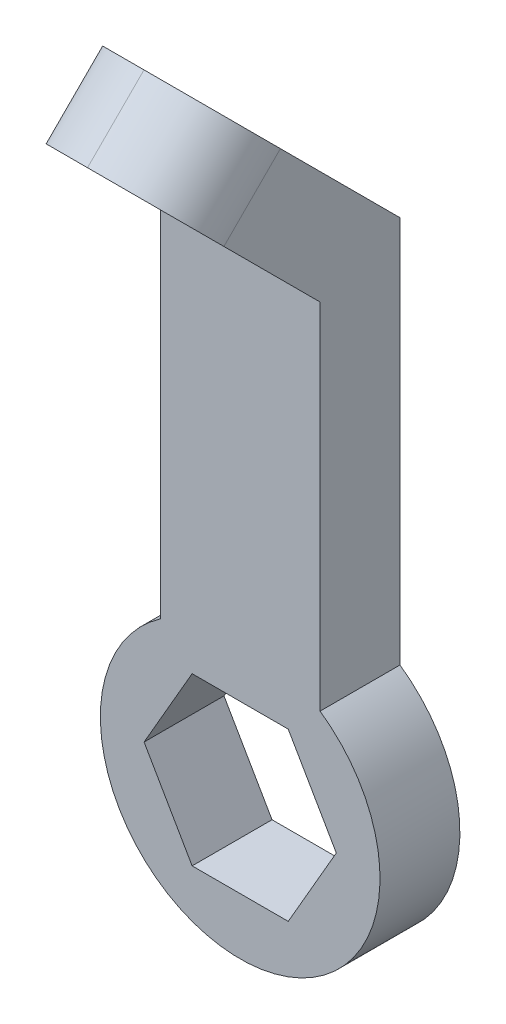
ISO-10303-21;
HEADER;
FILE_DESCRIPTION(('STEP AP214'),'2;1');
FILE_NAME('part.step','',(''),(''),'','','');
FILE_SCHEMA(('AUTOMOTIVE_DESIGN { 1 0 10303 214 1 1 1 1 }'));
ENDSEC;
DATA;
#1=APPLICATION_CONTEXT('core data for automotive mechanical design processes');
#2=APPLICATION_PROTOCOL_DEFINITION('international standard','automotive_design',2000,#1);
#3=PRODUCT_CONTEXT('',#1,'mechanical');
#4=PRODUCT('Part','Part','',(#3));
#5=PRODUCT_RELATED_PRODUCT_CATEGORY('part','',(#4));
#6=PRODUCT_DEFINITION_FORMATION('','',#4);
#7=PRODUCT_DEFINITION_CONTEXT('part definition',#1,'design');
#8=PRODUCT_DEFINITION('design','',#6,#7);
#9=PRODUCT_DEFINITION_SHAPE('','',#8);
#10=(LENGTH_UNIT() NAMED_UNIT(*) SI_UNIT(.MILLI.,.METRE.));
#11=(NAMED_UNIT(*) PLANE_ANGLE_UNIT() SI_UNIT($,.RADIAN.));
#12=(NAMED_UNIT(*) SI_UNIT($,.STERADIAN.) SOLID_ANGLE_UNIT());
#13=UNCERTAINTY_MEASURE_WITH_UNIT(LENGTH_MEASURE(1.E-05),#10,'distance_accuracy_value','');
#14=(GEOMETRIC_REPRESENTATION_CONTEXT(3) GLOBAL_UNCERTAINTY_ASSIGNED_CONTEXT((#13)) GLOBAL_UNIT_ASSIGNED_CONTEXT((#10,
#11,#12)) REPRESENTATION_CONTEXT('',''));
#15=CARTESIAN_POINT('',(0.,0.,0.));
#16=DIRECTION('',(0.,0.,1.));
#17=DIRECTION('',(1.,0.,0.));
#18=AXIS2_PLACEMENT_3D('',#15,#16,#17);
#19=CARTESIAN_POINT('',(0.,21497.4193257272,4507.64904237391));
#20=DIRECTION('',(0.,0.,-1.));
#21=DIRECTION('',(-1.,0.,0.));
#22=AXIS2_PLACEMENT_3D('',#19,#20,#21);
#23=PLANE('',#22);
#24=DIRECTION('',(-0.5,0.866025403784438,0.));
#25=VECTOR('',#24,1.);
#26=CARTESIAN_POINT('',(-10.8253175473055,21491.1693257272,4507.64904237391));
#27=LINE('',#26,#25);
#28=CARTESIAN_POINT('',(-7.21687836487034,21484.9193257272,4507.64904237391));
#29=VERTEX_POINT('',#28);
#30=CARTESIAN_POINT('',(-14.4337567297407,21497.4193257272,4507.64904237391));
#31=VERTEX_POINT('',#30);
#32=EDGE_CURVE('E260',#29,#31,#27,.T.);
#33=ORIENTED_EDGE('',*,*,#32,.T.);
#34=DIRECTION('',(0.5,0.866025403784439,0.));
#35=VECTOR('',#34,1.);
#36=CARTESIAN_POINT('',(-10.8253175473055,21503.6693257272,4507.64904237391));
#37=LINE('',#36,#35);
#38=CARTESIAN_POINT('',(-7.21687836487035,21509.9193257272,4507.64904237391));
#39=VERTEX_POINT('',#38);
#40=EDGE_CURVE('E263',#31,#39,#37,.T.);
#41=ORIENTED_EDGE('',*,*,#40,.T.);
#42=DIRECTION('',(1.,0.,0.));
#43=VECTOR('',#42,1.);
#44=CARTESIAN_POINT('',(0.,21509.9193257272,4507.64904237391));
#45=LINE('',#44,#43);
#46=CARTESIAN_POINT('',(7.21687836487029,21509.9193257272,4507.64904237391));
#47=VERTEX_POINT('',#46);
#48=EDGE_CURVE('E245',#39,#47,#45,.T.);
#49=ORIENTED_EDGE('',*,*,#48,.T.);
#50=DIRECTION('',(0.500000000000001,-0.866025403784438,0.));
#51=VECTOR('',#50,1.);
#52=CARTESIAN_POINT('',(10.8253175473055,21503.6693257272,4507.64904237391));
#53=LINE('',#52,#51);
#54=CARTESIAN_POINT('',(14.4337567297406,21497.4193257272,4507.64904237391));
#55=VERTEX_POINT('',#54);
#56=EDGE_CURVE('E218',#47,#55,#53,.T.);
#57=ORIENTED_EDGE('',*,*,#56,.T.);
#58=DIRECTION('',(-0.5,-0.866025403784439,0.));
#59=VECTOR('',#58,1.);
#60=CARTESIAN_POINT('',(10.8253175473055,21491.1693257272,4507.64904237391));
#61=LINE('',#60,#59);
#62=CARTESIAN_POINT('',(7.21687836487029,21484.9193257272,4507.64904237391));
#63=VERTEX_POINT('',#62);
#64=EDGE_CURVE('E254',#55,#63,#61,.T.);
#65=ORIENTED_EDGE('',*,*,#64,.T.);
#66=DIRECTION('',(-1.,0.,0.));
#67=VECTOR('',#66,1.);
#68=CARTESIAN_POINT('',(0.,21484.9193257272,4507.64904237391));
#69=LINE('',#68,#67);
#70=EDGE_CURVE('E257',#63,#29,#69,.T.);
#71=ORIENTED_EDGE('',*,*,#70,.T.);
#72=EDGE_LOOP('',(#33,#41,#49,#57,#65,#71));
#73=FACE_BOUND('',#72,.T.);
#74=DIRECTION('',(1.,0.,0.));
#75=VECTOR('',#74,1.);
#76=CARTESIAN_POINT('',(0.,21567.8673257556,4507.64904237391));
#77=LINE('',#76,#75);
#78=CARTESIAN_POINT('',(-12.,21567.8673257556,4507.64904237391));
#79=VERTEX_POINT('',#78);
#80=CARTESIAN_POINT('',(12.,21567.8673257556,4507.64904237391));
#81=VERTEX_POINT('',#80);
#82=EDGE_CURVE('E295',#79,#81,#77,.T.);
#83=ORIENTED_EDGE('',*,*,#82,.F.);
#84=DIRECTION('',(0.,1.,0.));
#85=VECTOR('',#84,1.);
#86=CARTESIAN_POINT('',(-12.,21497.4193257272,4507.64904237391));
#87=LINE('',#86,#85);
#88=CARTESIAN_POINT('',(-12.,21514.6530145218,4507.64904237391));
#89=VERTEX_POINT('',#88);
#90=EDGE_CURVE('E280',#89,#79,#87,.T.);
#91=ORIENTED_EDGE('',*,*,#90,.F.);
#92=CARTESIAN_POINT('',(0.,21497.4193257272,4507.64904237391));
#93=DIRECTION('',(0.,0.,-1.));
#94=DIRECTION('',(-1.,0.,0.));
#95=AXIS2_PLACEMENT_3D('',#92,#93,#94);
#96=CIRCLE('',#95,21.0000007016508);
#97=CARTESIAN_POINT('',(12.,21514.6530145218,4507.64904237391));
#98=VERTEX_POINT('',#97);
#99=EDGE_CURVE('E289',#98,#89,#96,.T.);
#100=ORIENTED_EDGE('',*,*,#99,.F.);
#101=DIRECTION('',(0.,1.,0.));
#102=VECTOR('',#101,1.);
#103=CARTESIAN_POINT('',(12.,21497.4193257272,4507.64904237391));
#104=LINE('',#103,#102);
#105=EDGE_CURVE('E277',#98,#81,#104,.T.);
#106=ORIENTED_EDGE('',*,*,#105,.T.);
#107=EDGE_LOOP('',(#83,#91,#100,#106));
#108=FACE_BOUND('',#107,.T.);
#109=ADVANCED_FACE('F117',(#73,#108),#23,.F.);
#110=CARTESIAN_POINT('',(0.,21497.4193257272,4495.64904237391));
#111=DIRECTION('',(0.,0.,-1.));
#112=DIRECTION('',(-1.,0.,0.));
#113=AXIS2_PLACEMENT_3D('',#110,#111,#112);
#114=PLANE('',#113);
#115=DIRECTION('',(0.5,0.866025403784439,0.));
#116=VECTOR('',#115,1.);
#117=CARTESIAN_POINT('',(-10.8253175473055,21503.6693257272,4495.64904237391));
#118=LINE('',#117,#116);
#119=CARTESIAN_POINT('',(-14.4337567297407,21497.4193257272,4495.64904237391));
#120=VERTEX_POINT('',#119);
#121=CARTESIAN_POINT('',(-7.21687836487035,21509.9193257272,4495.64904237391));
#122=VERTEX_POINT('',#121);
#123=EDGE_CURVE('E141',#120,#122,#118,.T.);
#124=ORIENTED_EDGE('',*,*,#123,.F.);
#125=DIRECTION('',(-0.5,0.866025403784438,0.));
#126=VECTOR('',#125,1.);
#127=CARTESIAN_POINT('',(-10.8253175473055,21491.1693257272,4495.64904237391));
#128=LINE('',#127,#126);
#129=CARTESIAN_POINT('',(-7.21687836487034,21484.9193257272,4495.64904237391));
#130=VERTEX_POINT('',#129);
#131=EDGE_CURVE('E240',#130,#120,#128,.T.);
#132=ORIENTED_EDGE('',*,*,#131,.F.);
#133=DIRECTION('',(-1.,0.,0.));
#134=VECTOR('',#133,1.);
#135=CARTESIAN_POINT('',(0.,21484.9193257272,4495.64904237391));
#136=LINE('',#135,#134);
#137=CARTESIAN_POINT('',(7.21687836487029,21484.9193257272,4495.64904237391));
#138=VERTEX_POINT('',#137);
#139=EDGE_CURVE('E234',#138,#130,#136,.T.);
#140=ORIENTED_EDGE('',*,*,#139,.F.);
#141=DIRECTION('',(-0.5,-0.866025403784439,0.));
#142=VECTOR('',#141,1.);
#143=CARTESIAN_POINT('',(10.8253175473055,21491.1693257272,4495.64904237391));
#144=LINE('',#143,#142);
#145=CARTESIAN_POINT('',(14.4337567297406,21497.4193257272,4495.64904237391));
#146=VERTEX_POINT('',#145);
#147=EDGE_CURVE('E232',#146,#138,#144,.T.);
#148=ORIENTED_EDGE('',*,*,#147,.F.);
#149=DIRECTION('',(0.5,-0.866025403784438,0.));
#150=VECTOR('',#149,1.);
#151=CARTESIAN_POINT('',(10.8253175473055,21503.6693257272,4495.64904237391));
#152=LINE('',#151,#150);
#153=CARTESIAN_POINT('',(7.21687836487029,21509.9193257272,4495.64904237391));
#154=VERTEX_POINT('',#153);
#155=EDGE_CURVE('E215',#154,#146,#152,.T.);
#156=ORIENTED_EDGE('',*,*,#155,.F.);
#157=DIRECTION('',(1.,0.,0.));
#158=VECTOR('',#157,1.);
#159=CARTESIAN_POINT('',(0.,21509.9193257272,4495.64904237391));
#160=LINE('',#159,#158);
#161=EDGE_CURVE('E224',#122,#154,#160,.T.);
#162=ORIENTED_EDGE('',*,*,#161,.F.);
#163=EDGE_LOOP('',(#124,#132,#140,#148,#156,#162));
#164=FACE_BOUND('',#163,.T.);
#165=DIRECTION('',(0.,1.,0.));
#166=VECTOR('',#165,1.);
#167=CARTESIAN_POINT('',(12.,21497.4193257272,4495.64904237391));
#168=LINE('',#167,#166);
#169=CARTESIAN_POINT('',(12.,21514.6530145218,4495.64904237391));
#170=VERTEX_POINT('',#169);
#171=CARTESIAN_POINT('',(12.,21572.83788957,4495.64904237391));
#172=VERTEX_POINT('',#171);
#173=EDGE_CURVE('E285',#170,#172,#168,.T.);
#174=ORIENTED_EDGE('',*,*,#173,.F.);
#175=CARTESIAN_POINT('',(0.,21497.4193257272,4495.64904237391));
#176=DIRECTION('',(0.,0.,-1.));
#177=DIRECTION('',(-1.,0.,0.));
#178=AXIS2_PLACEMENT_3D('',#175,#176,#177);
#179=CIRCLE('',#178,21.0000007016508);
#180=CARTESIAN_POINT('',(-12.,21514.6530145218,4495.64904237391));
#181=VERTEX_POINT('',#180);
#182=EDGE_CURVE('E272',#170,#181,#179,.T.);
#183=ORIENTED_EDGE('',*,*,#182,.T.);
#184=DIRECTION('',(0.,1.,0.));
#185=VECTOR('',#184,1.);
#186=CARTESIAN_POINT('',(-12.,21497.4193257272,4495.64904237391));
#187=LINE('',#186,#185);
#188=CARTESIAN_POINT('',(-12.,21572.83788957,4495.64904237391));
#189=VERTEX_POINT('',#188);
#190=EDGE_CURVE('E288',#181,#189,#187,.T.);
#191=ORIENTED_EDGE('',*,*,#190,.T.);
#192=DIRECTION('',(1.,0.,0.));
#193=VECTOR('',#192,1.);
#194=CARTESIAN_POINT('',(0.,21572.83788957,4495.64904237391));
#195=LINE('',#194,#193);
#196=EDGE_CURVE('E281',#189,#172,#195,.T.);
#197=ORIENTED_EDGE('',*,*,#196,.T.);
#198=EDGE_LOOP('',(#174,#183,#191,#197));
#199=FACE_BOUND('',#198,.T.);
#200=ADVANCED_FACE('F228',(#164,#199),#114,.T.);
#201=CARTESIAN_POINT('',(-12.,21497.4193257272,4507.64904237391));
#202=DIRECTION('',(-1.,0.,0.));
#203=DIRECTION('',(0.,0.,1.));
#204=AXIS2_PLACEMENT_3D('',#201,#202,#203);
#205=PLANE('',#204);
#206=DIRECTION('',(0.,0.707106673962432,0.707106888410646));
#207=VECTOR('',#206,1.);
#208=CARTESIAN_POINT('',(-12.,21564.3526069091,4504.13432246146));
#209=LINE('',#208,#207);
#210=CARTESIAN_POINT('',(-12.,21582.3131164277,4522.09483742709));
#211=VERTEX_POINT('',#210);
#212=EDGE_CURVE('E266',#79,#211,#209,.T.);
#213=ORIENTED_EDGE('',*,*,#212,.T.);
#214=DIRECTION('',(0.,0.707106888410647,-0.707106673962432));
#215=VECTOR('',#214,1.);
#216=CARTESIAN_POINT('',(-12.,21547.089105731,4557.31883744128));
#217=LINE('',#216,#215);
#218=CARTESIAN_POINT('',(-12.,21590.7983990886,4513.60955733954));
#219=VERTEX_POINT('',#218);
#220=EDGE_CURVE('E12',#211,#219,#217,.T.);
#221=ORIENTED_EDGE('',*,*,#220,.T.);
#222=DIRECTION('',(0.,0.707106673962432,0.707106888410646));
#223=VECTOR('',#222,1.);
#224=CARTESIAN_POINT('',(-12.,21572.83788957,4495.64904237391));
#225=LINE('',#224,#223);
#226=EDGE_CURVE('E273',#189,#219,#225,.T.);
#227=ORIENTED_EDGE('',*,*,#226,.F.);
#228=ORIENTED_EDGE('',*,*,#190,.F.);
#229=DIRECTION('',(0.,0.,-1.));
#230=VECTOR('',#229,1.);
#231=CARTESIAN_POINT('',(-12.,21514.6530145218,4507.64904237391));
#232=LINE('',#231,#230);
#233=EDGE_CURVE('E293',#89,#181,#232,.T.);
#234=ORIENTED_EDGE('',*,*,#233,.F.);
#235=ORIENTED_EDGE('',*,*,#90,.T.);
#236=EDGE_LOOP('',(#213,#221,#227,#228,#234,#235));
#237=FACE_BOUND('',#236,.T.);
#238=ADVANCED_FACE('F338',(#237),#205,.T.);
#239=CARTESIAN_POINT('',(12.,21497.4193257272,4507.64904237391));
#240=DIRECTION('',(-1.,0.,0.));
#241=DIRECTION('',(0.,0.,1.));
#242=AXIS2_PLACEMENT_3D('',#239,#240,#241);
#243=PLANE('',#242);
#244=DIRECTION('',(0.,-0.707106673962432,-0.707106888410646));
#245=VECTOR('',#244,1.);
#246=CARTESIAN_POINT('',(12.,21572.83788957,4495.64904237391));
#247=LINE('',#246,#245);
#248=CARTESIAN_POINT('',(12.,21590.7983990886,4513.60955733954));
#249=VERTEX_POINT('',#248);
#250=EDGE_CURVE('E270',#249,#172,#247,.T.);
#251=ORIENTED_EDGE('',*,*,#250,.F.);
#252=DIRECTION('',(0.,0.707106888410647,-0.707106673962432));
#253=VECTOR('',#252,1.);
#254=CARTESIAN_POINT('',(12.,21582.3131164277,4522.09483742709));
#255=LINE('',#254,#253);
#256=CARTESIAN_POINT('',(12.,21582.3131164277,4522.09483742709));
#257=VERTEX_POINT('',#256);
#258=EDGE_CURVE('E307',#249,#257,#255,.F.);
#259=ORIENTED_EDGE('',*,*,#258,.T.);
#260=DIRECTION('',(0.,-0.707106673962432,-0.707106888410646));
#261=VECTOR('',#260,1.);
#262=CARTESIAN_POINT('',(12.,21564.3526069091,4504.13432246146));
#263=LINE('',#262,#261);
#264=EDGE_CURVE('E269',#257,#81,#263,.T.);
#265=ORIENTED_EDGE('',*,*,#264,.T.);
#266=ORIENTED_EDGE('',*,*,#105,.F.);
#267=DIRECTION('',(0.,0.,-1.));
#268=VECTOR('',#267,1.);
#269=CARTESIAN_POINT('',(12.,21514.6530145218,4507.64904237391));
#270=LINE('',#269,#268);
#271=EDGE_CURVE('E284',#98,#170,#270,.T.);
#272=ORIENTED_EDGE('',*,*,#271,.T.);
#273=ORIENTED_EDGE('',*,*,#173,.T.);
#274=EDGE_LOOP('',(#251,#259,#265,#266,#272,#273));
#275=FACE_BOUND('',#274,.T.);
#276=ADVANCED_FACE('F331',(#275),#243,.F.);
#277=CARTESIAN_POINT('',(0.,21497.4193257272,4507.64904237391));
#278=DIRECTION('',(0.,0.,-1.));
#279=DIRECTION('',(-1.,0.,0.));
#280=AXIS2_PLACEMENT_3D('',#277,#278,#279);
#281=CYLINDRICAL_SURFACE('',#280,21.0000007016508);
#282=ORIENTED_EDGE('',*,*,#182,.F.);
#283=ORIENTED_EDGE('',*,*,#271,.F.);
#284=ORIENTED_EDGE('',*,*,#99,.T.);
#285=ORIENTED_EDGE('',*,*,#233,.T.);
#286=EDGE_LOOP('',(#282,#283,#284,#285));
#287=FACE_BOUND('',#286,.T.);
#288=ADVANCED_FACE('F343',(#287),#281,.T.);
#289=CARTESIAN_POINT('',(0.,21526.643336424,4466.42504054008));
#290=DIRECTION('',(0.,0.707106888410646,-0.707106673962432));
#291=DIRECTION('',(0.,0.707106673962432,0.707106888410646));
#292=AXIS2_PLACEMENT_3D('',#289,#290,#291);
#293=PLANE('',#292);
#294=CARTESIAN_POINT('',(0.,21579.4846897319,4519.26640987345));
#295=DIRECTION('',(0.,0.707106888410646,-0.707106673962432));
#296=DIRECTION('',(0.,0.707106673962432,0.707106888410646));
#297=AXIS2_PLACEMENT_3D('',#294,#295,#296);
#298=CIRCLE('',#297,4.00000000000074);
#299=CARTESIAN_POINT('',(0.,21582.3131164277,4522.0948374271));
#300=VERTEX_POINT('',#299);
#301=EDGE_CURVE('E405',#300,#300,#298,.T.);
#302=ORIENTED_EDGE('',*,*,#301,.T.);
#303=EDGE_LOOP('',(#302));
#304=FACE_BOUND('',#303,.T.);
#305=ORIENTED_EDGE('',*,*,#264,.F.);
#306=CARTESIAN_POINT('',(0.,21582.3131164277,4522.09483742709));
#307=DIRECTION('',(0.,0.707106888410646,-0.707106673962432));
#308=DIRECTION('',(0.,0.707106673962432,0.707106888410646));
#309=AXIS2_PLACEMENT_3D('',#306,#307,#308);
#310=CIRCLE('',#309,12.);
#311=CARTESIAN_POINT('',(0.,21590.7983965153,4530.58012008802));
#312=VERTEX_POINT('',#311);
#313=EDGE_CURVE('E126',#257,#312,#310,.F.);
#314=ORIENTED_EDGE('',*,*,#313,.T.);
#315=CARTESIAN_POINT('',(0.,21582.3131164277,4522.09483742709));
#316=DIRECTION('',(0.,0.707106888410646,-0.707106673962432));
#317=DIRECTION('',(0.,0.707106673962432,0.707106888410646));
#318=AXIS2_PLACEMENT_3D('',#315,#316,#317);
#319=CIRCLE('',#318,12.);
#320=EDGE_CURVE('E310',#312,#211,#319,.F.);
#321=ORIENTED_EDGE('',*,*,#320,.T.);
#322=ORIENTED_EDGE('',*,*,#212,.F.);
#323=ORIENTED_EDGE('',*,*,#82,.T.);
#324=EDGE_LOOP('',(#305,#314,#321,#322,#323));
#325=FACE_BOUND('',#324,.T.);
#326=ADVANCED_FACE('F315',(#304,#325),#293,.F.);
#327=CARTESIAN_POINT('',(0.,21535.1286190849,4457.93976045253));
#328=DIRECTION('',(0.,0.707106888410646,-0.707106673962432));
#329=DIRECTION('',(0.,0.707106673962432,0.707106888410646));
#330=AXIS2_PLACEMENT_3D('',#327,#328,#329);
#331=PLANE('',#330);
#332=CARTESIAN_POINT('',(0.,21587.9699723928,4510.78112978591));
#333=DIRECTION('',(0.,0.707106888410646,-0.707106673962432));
#334=DIRECTION('',(0.,0.707106673962432,0.707106888410646));
#335=AXIS2_PLACEMENT_3D('',#332,#333,#334);
#336=CIRCLE('',#335,7.99999999999813);
#337=CARTESIAN_POINT('',(0.,21593.6268257845,4516.43798489319));
#338=VERTEX_POINT('',#337);
#339=EDGE_CURVE('E406',#338,#338,#336,.T.);
#340=ORIENTED_EDGE('',*,*,#339,.F.);
#341=EDGE_LOOP('',(#340));
#342=FACE_BOUND('',#341,.T.);
#343=CARTESIAN_POINT('',(0.,21590.7983990886,4513.60955733954));
#344=DIRECTION('',(0.,0.707106888410646,-0.707106673962432));
#345=DIRECTION('',(0.,0.707106673962432,0.707106888410646));
#346=AXIS2_PLACEMENT_3D('',#343,#344,#345);
#347=CIRCLE('',#346,12.);
#348=CARTESIAN_POINT('',(0.,21599.2836791762,4522.09484000047));
#349=VERTEX_POINT('',#348);
#350=EDGE_CURVE('E303',#219,#349,#347,.T.);
#351=ORIENTED_EDGE('',*,*,#350,.T.);
#352=CARTESIAN_POINT('',(0.,21590.7983990886,4513.60955733954));
#353=DIRECTION('',(0.,0.707106888410646,-0.707106673962432));
#354=DIRECTION('',(0.,0.707106673962432,0.707106888410646));
#355=AXIS2_PLACEMENT_3D('',#352,#353,#354);
#356=CIRCLE('',#355,12.);
#357=EDGE_CURVE('E305',#349,#249,#356,.T.);
#358=ORIENTED_EDGE('',*,*,#357,.T.);
#359=ORIENTED_EDGE('',*,*,#250,.T.);
#360=ORIENTED_EDGE('',*,*,#196,.F.);
#361=ORIENTED_EDGE('',*,*,#226,.T.);
#362=EDGE_LOOP('',(#351,#358,#359,#360,#361));
#363=FACE_BOUND('',#362,.T.);
#364=ADVANCED_FACE('F328',(#342,#363),#331,.T.);
#365=CARTESIAN_POINT('',(0.,21547.089105731,4557.31883744128));
#366=DIRECTION('',(0.,0.707106888410647,-0.707106673962432));
#367=DIRECTION('',(0.,0.707106673962432,0.707106888410647));
#368=AXIS2_PLACEMENT_3D('',#365,#366,#367);
#369=CYLINDRICAL_SURFACE('',#368,12.);
#370=ORIENTED_EDGE('',*,*,#220,.F.);
#371=ORIENTED_EDGE('',*,*,#320,.F.);
#372=DIRECTION('',(0.,0.707106888410647,-0.707106673962432));
#373=VECTOR('',#372,1.);
#374=CARTESIAN_POINT('',(0.,21590.7983965153,4530.58012008802));
#375=LINE('',#374,#373);
#376=EDGE_CURVE('E121',#349,#312,#375,.F.);
#377=ORIENTED_EDGE('',*,*,#376,.F.);
#378=ORIENTED_EDGE('',*,*,#350,.F.);
#379=EDGE_LOOP('',(#370,#371,#377,#378));
#380=FACE_BOUND('',#379,.T.);
#381=ADVANCED_FACE('F119',(#380),#369,.T.);
#382=CARTESIAN_POINT('',(0.,21582.3131164277,4522.09483742709));
#383=DIRECTION('',(0.,-0.707106888410647,0.707106673962432));
#384=DIRECTION('',(0.,-0.707106673962432,-0.707106888410647));
#385=AXIS2_PLACEMENT_3D('',#382,#383,#384);
#386=CYLINDRICAL_SURFACE('',#385,12.);
#387=ORIENTED_EDGE('',*,*,#313,.F.);
#388=ORIENTED_EDGE('',*,*,#258,.F.);
#389=ORIENTED_EDGE('',*,*,#357,.F.);
#390=ORIENTED_EDGE('',*,*,#376,.T.);
#391=EDGE_LOOP('',(#387,#388,#389,#390));
#392=FACE_BOUND('',#391,.T.);
#393=ADVANCED_FACE('F325',(#392),#386,.T.);
#394=CARTESIAN_POINT('',(-10.8253175473055,21503.6693257272,4530.58012008802));
#395=DIRECTION('',(-0.866025403784439,0.5,0.));
#396=DIRECTION('',(-0.5,-0.866025403784439,0.));
#397=AXIS2_PLACEMENT_3D('',#394,#395,#396);
#398=PLANE('',#397);
#399=DIRECTION('',(0.,0.,-1.));
#400=VECTOR('',#399,1.);
#401=CARTESIAN_POINT('',(-14.4337567297407,21497.4193257272,4530.58012008802));
#402=LINE('',#401,#400);
#403=EDGE_CURVE('E243',#31,#120,#402,.T.);
#404=ORIENTED_EDGE('',*,*,#403,.T.);
#405=ORIENTED_EDGE('',*,*,#123,.T.);
#406=DIRECTION('',(0.,0.,-1.));
#407=VECTOR('',#406,1.);
#408=CARTESIAN_POINT('',(-7.21687836487035,21509.9193257272,4530.58012008802));
#409=LINE('',#408,#407);
#410=EDGE_CURVE('E221',#39,#122,#409,.T.);
#411=ORIENTED_EDGE('',*,*,#410,.F.);
#412=ORIENTED_EDGE('',*,*,#40,.F.);
#413=EDGE_LOOP('',(#404,#405,#411,#412));
#414=FACE_BOUND('',#413,.T.);
#415=ADVANCED_FACE('F367',(#414),#398,.F.);
#416=CARTESIAN_POINT('',(-10.8253175473055,21491.1693257272,4530.58012008802));
#417=DIRECTION('',(-0.866025403784438,-0.5,0.));
#418=DIRECTION('',(0.5,-0.866025403784438,0.));
#419=AXIS2_PLACEMENT_3D('',#416,#417,#418);
#420=PLANE('',#419);
#421=DIRECTION('',(0.,0.,-1.));
#422=VECTOR('',#421,1.);
#423=CARTESIAN_POINT('',(-7.21687836487034,21484.9193257272,4530.58012008802));
#424=LINE('',#423,#422);
#425=EDGE_CURVE('E246',#29,#130,#424,.T.);
#426=ORIENTED_EDGE('',*,*,#425,.T.);
#427=ORIENTED_EDGE('',*,*,#131,.T.);
#428=ORIENTED_EDGE('',*,*,#403,.F.);
#429=ORIENTED_EDGE('',*,*,#32,.F.);
#430=EDGE_LOOP('',(#426,#427,#428,#429));
#431=FACE_BOUND('',#430,.T.);
#432=ADVANCED_FACE('F370',(#431),#420,.F.);
#433=CARTESIAN_POINT('',(0.,21484.9193257272,4530.58012008802));
#434=DIRECTION('',(0.,-1.,0.));
#435=DIRECTION('',(1.,0.,0.));
#436=AXIS2_PLACEMENT_3D('',#433,#434,#435);
#437=PLANE('',#436);
#438=DIRECTION('',(0.,0.,-1.));
#439=VECTOR('',#438,1.);
#440=CARTESIAN_POINT('',(7.21687836487029,21484.9193257272,4530.58012008802));
#441=LINE('',#440,#439);
#442=EDGE_CURVE('E248',#63,#138,#441,.T.);
#443=ORIENTED_EDGE('',*,*,#442,.T.);
#444=ORIENTED_EDGE('',*,*,#139,.T.);
#445=ORIENTED_EDGE('',*,*,#425,.F.);
#446=ORIENTED_EDGE('',*,*,#70,.F.);
#447=EDGE_LOOP('',(#443,#444,#445,#446));
#448=FACE_BOUND('',#447,.T.);
#449=ADVANCED_FACE('F379',(#448),#437,.F.);
#450=CARTESIAN_POINT('',(10.8253175473055,21491.1693257272,4530.58012008802));
#451=DIRECTION('',(0.866025403784439,-0.5,0.));
#452=DIRECTION('',(0.5,0.866025403784439,0.));
#453=AXIS2_PLACEMENT_3D('',#450,#451,#452);
#454=PLANE('',#453);
#455=DIRECTION('',(0.,0.,-1.));
#456=VECTOR('',#455,1.);
#457=CARTESIAN_POINT('',(14.4337567297406,21497.4193257272,4530.58012008802));
#458=LINE('',#457,#456);
#459=EDGE_CURVE('E220',#55,#146,#458,.T.);
#460=ORIENTED_EDGE('',*,*,#459,.T.);
#461=ORIENTED_EDGE('',*,*,#147,.T.);
#462=ORIENTED_EDGE('',*,*,#442,.F.);
#463=ORIENTED_EDGE('',*,*,#64,.F.);
#464=EDGE_LOOP('',(#460,#461,#462,#463));
#465=FACE_BOUND('',#464,.T.);
#466=ADVANCED_FACE('F376',(#465),#454,.F.);
#467=CARTESIAN_POINT('',(10.8253175473055,21503.6693257272,4530.58012008802));
#468=DIRECTION('',(0.866025403784438,0.5,0.));
#469=DIRECTION('',(-0.500000000000001,0.866025403784438,0.));
#470=AXIS2_PLACEMENT_3D('',#467,#468,#469);
#471=PLANE('',#470);
#472=DIRECTION('',(0.,0.,-1.));
#473=VECTOR('',#472,1.);
#474=CARTESIAN_POINT('',(7.21687836487029,21509.9193257272,4530.58012008802));
#475=LINE('',#474,#473);
#476=EDGE_CURVE('E133',#47,#154,#475,.T.);
#477=ORIENTED_EDGE('',*,*,#476,.T.);
#478=ORIENTED_EDGE('',*,*,#155,.T.);
#479=ORIENTED_EDGE('',*,*,#459,.F.);
#480=ORIENTED_EDGE('',*,*,#56,.F.);
#481=EDGE_LOOP('',(#477,#478,#479,#480));
#482=FACE_BOUND('',#481,.T.);
#483=ADVANCED_FACE('F212',(#482),#471,.F.);
#484=CARTESIAN_POINT('',(0.,21509.9193257272,4530.58012008802));
#485=DIRECTION('',(0.,1.,0.));
#486=DIRECTION('',(-1.,0.,0.));
#487=AXIS2_PLACEMENT_3D('',#484,#485,#486);
#488=PLANE('',#487);
#489=ORIENTED_EDGE('',*,*,#410,.T.);
#490=ORIENTED_EDGE('',*,*,#161,.T.);
#491=ORIENTED_EDGE('',*,*,#476,.F.);
#492=ORIENTED_EDGE('',*,*,#48,.F.);
#493=EDGE_LOOP('',(#489,#490,#491,#492));
#494=FACE_BOUND('',#493,.T.);
#495=ADVANCED_FACE('F225',(#494),#488,.F.);
#496=CARTESIAN_POINT('',(0.,21584.3283719175,4514.42272915681));
#497=DIRECTION('',(0.,0.707106888410646,-0.707106673962432));
#498=DIRECTION('',(0.,0.707106673962432,0.707106888410646));
#499=AXIS2_PLACEMENT_3D('',#496,#497,#498);
#500=CYLINDRICAL_SURFACE('',#499,7.99999999999813);
#501=CARTESIAN_POINT('',(0.,21584.3283719175,4514.42272915681));
#502=DIRECTION('',(0.,0.707106888410646,-0.707106673962432));
#503=DIRECTION('',(0.,0.707106673962432,0.707106888410646));
#504=AXIS2_PLACEMENT_3D('',#501,#502,#503);
#505=CIRCLE('',#504,7.99999999999813);
#506=CARTESIAN_POINT('',(0.,21589.9852253092,4520.0795842641));
#507=VERTEX_POINT('',#506);
#508=EDGE_CURVE('E409',#507,#507,#505,.T.);
#509=CARTESIAN_POINT('',(0.,21589.9852253092,4520.0795842641));
#510=CARTESIAN_POINT('',(0.,21590.0231586475,4520.04165093732));
#511=CARTESIAN_POINT('',(0.,21590.0610919858,4520.00371761054));
#512=CARTESIAN_POINT('',(0.,21590.1369586623,4519.92785095698));
#513=CARTESIAN_POINT('',(0.,21590.1748920006,4519.8899176302));
#514=CARTESIAN_POINT('',(0.,21590.2507586772,4519.81405097664));
#515=CARTESIAN_POINT('',(0.,21590.2886920155,4519.77611764986));
#516=CARTESIAN_POINT('',(0.,21590.364558692,4519.7002509963));
#517=CARTESIAN_POINT('',(0.,21590.4024920303,4519.66231766952));
#518=CARTESIAN_POINT('',(0.,21590.4783587069,4519.58645101595));
#519=CARTESIAN_POINT('',(0.,21590.5162920452,4519.54851768918));
#520=CARTESIAN_POINT('',(0.,21590.5921587217,4519.47265103561));
#521=CARTESIAN_POINT('',(0.,21590.63009206,4519.43471770883));
#522=CARTESIAN_POINT('',(0.,21590.7059587366,4519.35885105527));
#523=CARTESIAN_POINT('',(0.,21590.7438920749,4519.32091772849));
#524=CARTESIAN_POINT('',(0.,21590.8197587514,4519.24505107493));
#525=CARTESIAN_POINT('',(0.,21590.8576920897,4519.20711774815));
#526=CARTESIAN_POINT('',(0.,21590.9335587663,4519.13125109459));
#527=CARTESIAN_POINT('',(0.,21590.9714921046,4519.09331776781));
#528=CARTESIAN_POINT('',(0.,21591.0473587812,4519.01745111425));
#529=CARTESIAN_POINT('',(0.,21591.0852921194,4518.97951778747));
#530=CARTESIAN_POINT('',(0.,21591.161158796,4518.90365113391));
#531=CARTESIAN_POINT('',(0.,21591.1990921343,4518.86571780713));
#532=CARTESIAN_POINT('',(0.,21591.2749588109,4518.78985115357));
#533=CARTESIAN_POINT('',(0.,21591.3128921491,4518.75191782679));
#534=CARTESIAN_POINT('',(0.,21591.3887588257,4518.67605117323));
#535=CARTESIAN_POINT('',(0.,21591.426692164,4518.63811784645));
#536=CARTESIAN_POINT('',(0.,21591.5025588406,4518.56225119289));
#537=CARTESIAN_POINT('',(0.,21591.5404921789,4518.52431786611));
#538=CARTESIAN_POINT('',(0.,21591.6163588554,4518.44845121255));
#539=CARTESIAN_POINT('',(0.,21591.6542921937,4518.41051788577));
#540=CARTESIAN_POINT('',(0.,21591.7301588703,4518.33465123221));
#541=CARTESIAN_POINT('',(0.,21591.7680922086,4518.29671790542));
#542=CARTESIAN_POINT('',(0.,21591.8439588851,4518.22085125186));
#543=CARTESIAN_POINT('',(0.,21591.8818922234,4518.18291792508));
#544=CARTESIAN_POINT('',(0.,21591.9577589,4518.10705127152));
#545=CARTESIAN_POINT('',(0.,21591.9956922383,4518.06911794474));
#546=CARTESIAN_POINT('',(0.,21592.0715589148,4517.99325129118));
#547=CARTESIAN_POINT('',(0.,21592.1094922531,4517.9553179644));
#548=CARTESIAN_POINT('',(0.,21592.1853589297,4517.87945131084));
#549=CARTESIAN_POINT('',(0.,21592.223292268,4517.84151798406));
#550=CARTESIAN_POINT('',(0.,21592.2991589445,4517.7656513305));
#551=CARTESIAN_POINT('',(0.,21592.3370922828,4517.72771800372));
#552=CARTESIAN_POINT('',(0.,21592.4129589594,4517.65185135016));
#553=CARTESIAN_POINT('',(0.,21592.4508922977,4517.61391802338));
#554=CARTESIAN_POINT('',(0.,21592.5267589742,4517.53805136982));
#555=CARTESIAN_POINT('',(0.,21592.5646923125,4517.50011804304));
#556=CARTESIAN_POINT('',(0.,21592.6405589891,4517.42425138948));
#557=CARTESIAN_POINT('',(0.,21592.6784923274,4517.3863180627));
#558=CARTESIAN_POINT('',(0.,21592.754359004,4517.31045140914));
#559=CARTESIAN_POINT('',(0.,21592.7922923422,4517.27251808236));
#560=CARTESIAN_POINT('',(0.,21592.8681590188,4517.1966514288));
#561=CARTESIAN_POINT('',(0.,21592.9060923571,4517.15871810202));
#562=CARTESIAN_POINT('',(0.,21592.9819590337,4517.08285144846));
#563=CARTESIAN_POINT('',(0.,21593.0198923719,4517.04491812168));
#564=CARTESIAN_POINT('',(0.,21593.0957590485,4516.96905146812));
#565=CARTESIAN_POINT('',(0.,21593.1336923868,4516.93111814133));
#566=CARTESIAN_POINT('',(0.,21593.2095590634,4516.85525148777));
#567=CARTESIAN_POINT('',(0.,21593.2474924017,4516.81731816099));
#568=CARTESIAN_POINT('',(0.,21593.3233590782,4516.74145150743));
#569=CARTESIAN_POINT('',(0.,21593.3612924165,4516.70351818065));
#570=CARTESIAN_POINT('',(0.,21593.4371590931,4516.62765152709));
#571=CARTESIAN_POINT('',(0.,21593.4750924314,4516.58971820031));
#572=CARTESIAN_POINT('',(0.,21593.5509591079,4516.51385154675));
#573=CARTESIAN_POINT('',(0.,21593.5888924462,4516.47591821997));
#574=CARTESIAN_POINT('',(0.,21593.6268257845,4516.43798489319));
#575=B_SPLINE_CURVE_WITH_KNOTS('',3,(#509,#510,#511,#512,#513,#514,#515,#516,#517,#518,#519,
#520,#521,#522,#523,#524,#525,#526,#527,#528,#529,#530,#531,#532,#533,#534,#535,#536,#537,#538,
#539,#540,#541,#542,#543,#544,#545,#546,#547,#548,#549,#550,#551,#552,#553,#554,#555,#556,#557,
#558,#559,#560,#561,#562,#563,#564,#565,#566,#567,#568,#569,#570,#571,#572,#573,#574),
.UNSPECIFIED.,.F.,.F.,(4,2,2,2,2,2,2,2,2,2,2,2,2,2,2,2,2,2,2,2,2,2,2,2,2,2,2,2,2,2,2,2,4),(0.,
0.160937499998256,0.321874999999025,0.482812500000422,0.643749999998678,0.804687500000075,
0.965624999998331,1.12656249999973,1.2875000000005,1.44843749999875,1.60937500000015,
1.77031249999841,1.9312499999998,2.09218750000057,2.25312499999946,2.41406250000022,
2.57499999999911,2.73593749999988,2.89687499999813,3.05781249999953,3.2187500000003,
3.37968749999918,3.54062499999995,3.70156249999884,3.86249999999961,4.02343750000037,
4.18437499999926,4.34531250000003,4.50624999999891,4.66718749999968,4.82812500000108,
4.98906249999933,5.1500000000001),.UNSPECIFIED.);
#576=EDGE_CURVE('BSEAM373',#507,#338,#575,.T.);
#577=ORIENTED_EDGE('',*,*,#508,.F.);
#578=ORIENTED_EDGE('',*,*,#339,.T.);
#579=ORIENTED_EDGE('',*,*,#576,.T.);
#580=ORIENTED_EDGE('',*,*,#576,.F.);
#581=EDGE_LOOP('',(#577,#579,#578,#580));
#582=FACE_BOUND('',#581,.T.);
#583=ADVANCED_FACE('F373',(#582),#500,.F.);
#584=CARTESIAN_POINT('',(0.,21584.3283719175,4514.42272915681));
#585=DIRECTION('',(0.,0.707106888410646,-0.707106673962432));
#586=DIRECTION('',(0.,0.707106673962432,0.707106888410646));
#587=AXIS2_PLACEMENT_3D('',#584,#585,#586);
#588=PLANE('',#587);
#589=CARTESIAN_POINT('',(0.,21584.3283719175,4514.42272915681));
#590=DIRECTION('',(0.,0.707106888410646,-0.707106673962432));
#591=DIRECTION('',(0.,0.707106673962432,0.707106888410646));
#592=AXIS2_PLACEMENT_3D('',#589,#590,#591);
#593=CIRCLE('',#592,4.00000000000074);
#594=CARTESIAN_POINT('',(0.,21587.1567986133,4517.25115671046));
#595=VERTEX_POINT('',#594);
#596=EDGE_CURVE('E402',#595,#595,#593,.T.);
#597=ORIENTED_EDGE('',*,*,#596,.F.);
#598=EDGE_LOOP('',(#597));
#599=FACE_BOUND('',#598,.T.);
#600=ORIENTED_EDGE('',*,*,#508,.T.);
#601=EDGE_LOOP('',(#600));
#602=FACE_BOUND('',#601,.T.);
#603=ADVANCED_FACE('F389',(#599,#602),#588,.T.);
#604=CARTESIAN_POINT('',(0.,21522.2951366428,4576.4559456183));
#605=DIRECTION('',(0.,0.707106888410646,-0.707106673962432));
#606=DIRECTION('',(0.,0.707106673962432,0.707106888410646));
#607=AXIS2_PLACEMENT_3D('',#604,#605,#606);
#608=CYLINDRICAL_SURFACE('',#607,4.00000000000074);
#609=CARTESIAN_POINT('',(0.,21587.1567986133,4517.25115671046));
#610=CARTESIAN_POINT('',(0.,21587.1063435906,4517.30161171792));
#611=CARTESIAN_POINT('',(0.,21587.0558885678,4517.35206672539));
#612=CARTESIAN_POINT('',(0.,21586.9549785223,4517.45297674032));
#613=CARTESIAN_POINT('',(0.,21586.9045234995,4517.50343174778));
#614=CARTESIAN_POINT('',(0.,21586.803613454,4517.60434176271));
#615=CARTESIAN_POINT('',(0.,21586.7531584312,4517.65479677018));
#616=CARTESIAN_POINT('',(0.,21586.6522483857,4517.75570678511));
#617=CARTESIAN_POINT('',(0.,21586.6017933629,4517.80616179257));
#618=CARTESIAN_POINT('',(0.,21586.5008833174,4517.9070718075));
#619=CARTESIAN_POINT('',(0.,21586.4504282946,4517.95752681497));
#620=CARTESIAN_POINT('',(0.,21586.3495182491,4518.0584368299));
#621=CARTESIAN_POINT('',(0.,21586.2990632263,4518.10889183736));
#622=CARTESIAN_POINT('',(0.,21586.1981531808,4518.20980185229));
#623=CARTESIAN_POINT('',(0.,21586.147698158,4518.26025685976));
#624=CARTESIAN_POINT('',(0.,21586.0467881125,4518.36116687469));
#625=CARTESIAN_POINT('',(0.,21585.9963330897,4518.41162188215));
#626=CARTESIAN_POINT('',(0.,21585.8954230442,4518.51253189708));
#627=CARTESIAN_POINT('',(0.,21585.8449680214,4518.56298690455));
#628=CARTESIAN_POINT('',(0.,21585.7440579759,4518.66389691948));
#629=CARTESIAN_POINT('',(0.,21585.6936029531,4518.71435192694));
#630=CARTESIAN_POINT('',(0.,21585.5926929076,4518.81526194187));
#631=CARTESIAN_POINT('',(0.,21585.5422378848,4518.86571694934));
#632=CARTESIAN_POINT('',(0.,21585.4413278393,4518.96662696427));
#633=CARTESIAN_POINT('',(0.,21585.3908728165,4519.01708197173));
#634=CARTESIAN_POINT('',(0.,21585.289962771,4519.11799198666));
#635=CARTESIAN_POINT('',(0.,21585.2395077482,4519.16844699413));
#636=CARTESIAN_POINT('',(0.,21585.1385977027,4519.26935700906));
#637=CARTESIAN_POINT('',(0.,21585.0881426799,4519.31981201652));
#638=CARTESIAN_POINT('',(0.,21584.9872326344,4519.42072203145));
#639=CARTESIAN_POINT('',(0.,21584.9367776116,4519.47117703892));
#640=CARTESIAN_POINT('',(0.,21584.8358675661,4519.57208705385));
#641=CARTESIAN_POINT('',(0.,21584.7854125433,4519.62254206131));
#642=CARTESIAN_POINT('',(0.,21584.6845024978,4519.72345207624));
#643=CARTESIAN_POINT('',(0.,21584.634047475,4519.77390708371));
#644=CARTESIAN_POINT('',(0.,21584.5331374295,4519.87481709864));
#645=CARTESIAN_POINT('',(0.,21584.4826824067,4519.9252721061));
#646=CARTESIAN_POINT('',(0.,21584.3817723612,4520.02618212103));
#647=CARTESIAN_POINT('',(0.,21584.3313173384,4520.0766371285));
#648=CARTESIAN_POINT('',(0.,21584.2304072929,4520.17754714343));
#649=CARTESIAN_POINT('',(0.,21584.1799522701,4520.22800215089));
#650=CARTESIAN_POINT('',(0.,21584.0790422246,4520.32891216582));
#651=CARTESIAN_POINT('',(0.,21584.0285872018,4520.37936717329));
#652=CARTESIAN_POINT('',(0.,21583.9276771563,4520.48027718822));
#653=CARTESIAN_POINT('',(0.,21583.8772221335,4520.53073219568));
#654=CARTESIAN_POINT('',(0.,21583.776312088,4520.63164221061));
#655=CARTESIAN_POINT('',(0.,21583.7258570652,4520.68209721808));
#656=CARTESIAN_POINT('',(0.,21583.6249470197,4520.78300723301));
#657=CARTESIAN_POINT('',(0.,21583.5744919969,4520.83346224047));
#658=CARTESIAN_POINT('',(0.,21583.4735819514,4520.9343722554));
#659=CARTESIAN_POINT('',(0.,21583.4231269286,4520.98482726287));
#660=CARTESIAN_POINT('',(0.,21583.3222168831,4521.0857372778));
#661=CARTESIAN_POINT('',(0.,21583.2717618603,4521.13619228526));
#662=CARTESIAN_POINT('',(0.,21583.1708518148,4521.23710230019));
#663=CARTESIAN_POINT('',(0.,21583.120396792,4521.28755730766));
#664=CARTESIAN_POINT('',(0.,21583.0194867465,4521.38846732259));
#665=CARTESIAN_POINT('',(0.,21582.9690317237,4521.43892233005));
#666=CARTESIAN_POINT('',(0.,21582.8681216782,4521.53983234498));
#667=CARTESIAN_POINT('',(0.,21582.8176666554,4521.59028735245));
#668=CARTESIAN_POINT('',(0.,21582.7167566099,4521.69119736738));
#669=CARTESIAN_POINT('',(0.,21582.6663015871,4521.74165237484));
#670=CARTESIAN_POINT('',(0.,21582.5653915416,4521.84256238977));
#671=CARTESIAN_POINT('',(0.,21582.5149365188,4521.89301739724));
#672=CARTESIAN_POINT('',(0.,21582.4140264733,4521.99392741217));
#673=CARTESIAN_POINT('',(0.,21582.3635714505,4522.04438241963));
#674=CARTESIAN_POINT('',(0.,21582.3131164277,4522.0948374271));
#675=B_SPLINE_CURVE_WITH_KNOTS('',3,(#609,#610,#611,#612,#613,#614,#615,#616,#617,#618,#619,
#620,#621,#622,#623,#624,#625,#626,#627,#628,#629,#630,#631,#632,#633,#634,#635,#636,#637,#638,
#639,#640,#641,#642,#643,#644,#645,#646,#647,#648,#649,#650,#651,#652,#653,#654,#655,#656,#657,
#658,#659,#660,#661,#662,#663,#664,#665,#666,#667,#668,#669,#670,#671,#672,#673,#674),
.UNSPECIFIED.,.F.,.F.,(4,2,2,2,2,2,2,2,2,2,2,2,2,2,2,2,2,2,2,2,2,2,2,2,2,2,2,2,2,2,2,2,4),(0.,
0.214062499997797,0.428124999998734,0.642187499997159,0.856249999998095,1.0703124999984,
1.28437499999683,1.49843749999777,1.7124999999987,1.9265624999965,2.14062499999744,
2.35468749999837,2.5687499999968,2.78281249999711,2.99687499999553,3.21093749999647,
3.42499999999741,3.6390624999952,3.85312499999614,4.06718749999708,4.2812499999955,
4.49531249999581,4.70937499999675,4.92343749999517,5.13749999999611,5.3515624999939,
5.56562499999484,5.77968749999578,5.9937499999942,6.20781249999451,6.42187499999545,
6.63593749999387,6.84999999999481),.UNSPECIFIED.);
#676=EDGE_CURVE('BSEAM393',#595,#300,#675,.T.);
#677=ORIENTED_EDGE('',*,*,#596,.T.);
#678=ORIENTED_EDGE('',*,*,#301,.F.);
#679=ORIENTED_EDGE('',*,*,#676,.T.);
#680=ORIENTED_EDGE('',*,*,#676,.F.);
#681=EDGE_LOOP('',(#677,#679,#678,#680));
#682=FACE_BOUND('',#681,.T.);
#683=ADVANCED_FACE('F393',(#682),#608,.F.);
#684=CLOSED_SHELL('',(#109,#200,#238,#276,#288,#326,#364,#381,#393,#415,#432,#449,#466,#483,
#495,#583,#603,#683));
#685=MANIFOLD_SOLID_BREP('B2',#684);
#686=ADVANCED_BREP_SHAPE_REPRESENTATION('',(#18,#685),#14);
#687=SHAPE_DEFINITION_REPRESENTATION(#9,#686);
ENDSEC;
END-ISO-10303-21;
